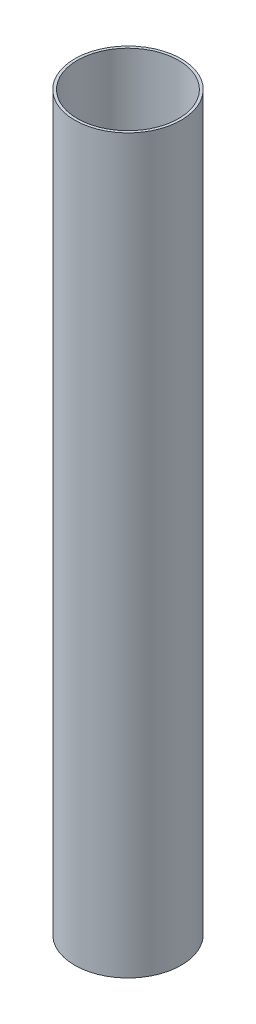
ISO-10303-21;
HEADER;
FILE_DESCRIPTION(('STEP AP214'),'2;1');
FILE_NAME('part.step','',(''),(''),'','','');
FILE_SCHEMA(('AUTOMOTIVE_DESIGN { 1 0 10303 214 1 1 1 1 }'));
ENDSEC;
DATA;
#1=APPLICATION_CONTEXT('core data for automotive mechanical design processes');
#2=APPLICATION_PROTOCOL_DEFINITION('international standard','automotive_design',2000,#1);
#3=PRODUCT_CONTEXT('',#1,'mechanical');
#4=PRODUCT('Part','Part','',(#3));
#5=PRODUCT_RELATED_PRODUCT_CATEGORY('part','',(#4));
#6=PRODUCT_DEFINITION_FORMATION('','',#4);
#7=PRODUCT_DEFINITION_CONTEXT('part definition',#1,'design');
#8=PRODUCT_DEFINITION('design','',#6,#7);
#9=PRODUCT_DEFINITION_SHAPE('','',#8);
#10=(LENGTH_UNIT() NAMED_UNIT(*) SI_UNIT(.MILLI.,.METRE.));
#11=(NAMED_UNIT(*) PLANE_ANGLE_UNIT() SI_UNIT($,.RADIAN.));
#12=(NAMED_UNIT(*) SI_UNIT($,.STERADIAN.) SOLID_ANGLE_UNIT());
#13=UNCERTAINTY_MEASURE_WITH_UNIT(LENGTH_MEASURE(1.E-05),#10,'distance_accuracy_value','');
#14=(GEOMETRIC_REPRESENTATION_CONTEXT(3) GLOBAL_UNCERTAINTY_ASSIGNED_CONTEXT((#13)) GLOBAL_UNIT_ASSIGNED_CONTEXT((#10,
#11,#12)) REPRESENTATION_CONTEXT('',''));
#15=CARTESIAN_POINT('',(0.,0.,0.));
#16=DIRECTION('',(0.,0.,1.));
#17=DIRECTION('',(1.,0.,0.));
#18=AXIS2_PLACEMENT_3D('',#15,#16,#17);
#19=CARTESIAN_POINT('',(0.,550.,0.));
#20=DIRECTION('',(0.,1.,0.));
#21=DIRECTION('',(0.,0.,1.));
#22=AXIS2_PLACEMENT_3D('',#19,#20,#21);
#23=PLANE('',#22);
#24=CARTESIAN_POINT('',(0.,550.,0.));
#25=DIRECTION('',(0.,1.,0.));
#26=DIRECTION('',(0.,0.,1.));
#27=AXIS2_PLACEMENT_3D('',#24,#25,#26);
#28=CIRCLE('',#27,40.);
#29=CARTESIAN_POINT('',(0.,550.,40.));
#30=VERTEX_POINT('',#29);
#31=EDGE_CURVE('E10',#30,#30,#28,.T.);
#32=ORIENTED_EDGE('',*,*,#31,.T.);
#33=EDGE_LOOP('',(#32));
#34=FACE_BOUND('',#33,.T.);
#35=CARTESIAN_POINT('',(0.,550.,0.));
#36=DIRECTION('',(0.,1.,0.));
#37=DIRECTION('',(0.,0.,1.));
#38=AXIS2_PLACEMENT_3D('',#35,#36,#37);
#39=CIRCLE('',#38,38.);
#40=CARTESIAN_POINT('',(0.,550.,38.));
#41=VERTEX_POINT('',#40);
#42=EDGE_CURVE('E46',#41,#41,#39,.T.);
#43=ORIENTED_EDGE('',*,*,#42,.F.);
#44=EDGE_LOOP('',(#43));
#45=FACE_BOUND('',#44,.T.);
#46=ADVANCED_FACE('F35',(#34,#45),#23,.T.);
#47=CARTESIAN_POINT('',(0.,0.,0.));
#48=DIRECTION('',(0.,1.,0.));
#49=DIRECTION('',(0.,0.,1.));
#50=AXIS2_PLACEMENT_3D('',#47,#48,#49);
#51=PLANE('',#50);
#52=CARTESIAN_POINT('',(0.,0.,0.));
#53=DIRECTION('',(0.,1.,0.));
#54=DIRECTION('',(0.,0.,1.));
#55=AXIS2_PLACEMENT_3D('',#52,#53,#54);
#56=CIRCLE('',#55,40.);
#57=CARTESIAN_POINT('',(0.,0.,40.));
#58=VERTEX_POINT('',#57);
#59=EDGE_CURVE('E39',#58,#58,#56,.T.);
#60=ORIENTED_EDGE('',*,*,#59,.F.);
#61=EDGE_LOOP('',(#60));
#62=FACE_BOUND('',#61,.T.);
#63=CARTESIAN_POINT('',(0.,0.,0.));
#64=DIRECTION('',(0.,1.,0.));
#65=DIRECTION('',(0.,0.,1.));
#66=AXIS2_PLACEMENT_3D('',#63,#64,#65);
#67=CIRCLE('',#66,38.);
#68=CARTESIAN_POINT('',(0.,0.,38.));
#69=VERTEX_POINT('',#68);
#70=EDGE_CURVE('E48',#69,#69,#67,.T.);
#71=ORIENTED_EDGE('',*,*,#70,.T.);
#72=EDGE_LOOP('',(#71));
#73=FACE_BOUND('',#72,.T.);
#74=ADVANCED_FACE('F58',(#62,#73),#51,.F.);
#75=CARTESIAN_POINT('',(0.,550.,0.));
#76=DIRECTION('',(0.,-1.,0.));
#77=DIRECTION('',(0.,0.,-1.));
#78=AXIS2_PLACEMENT_3D('',#75,#76,#77);
#79=CYLINDRICAL_SURFACE('',#78,40.);
#80=ORIENTED_EDGE('',*,*,#31,.F.);
#81=EDGE_LOOP('',(#80));
#82=FACE_BOUND('',#81,.T.);
#83=ORIENTED_EDGE('',*,*,#59,.T.);
#84=EDGE_LOOP('',(#83));
#85=FACE_BOUND('',#84,.T.);
#86=ADVANCED_FACE('F37',(#82,#85),#79,.T.);
#87=CARTESIAN_POINT('',(0.,550.,0.));
#88=DIRECTION('',(0.,-1.,0.));
#89=DIRECTION('',(0.,0.,-1.));
#90=AXIS2_PLACEMENT_3D('',#87,#88,#89);
#91=CYLINDRICAL_SURFACE('',#90,38.);
#92=ORIENTED_EDGE('',*,*,#42,.T.);
#93=EDGE_LOOP('',(#92));
#94=FACE_BOUND('',#93,.T.);
#95=ORIENTED_EDGE('',*,*,#70,.F.);
#96=EDGE_LOOP('',(#95));
#97=FACE_BOUND('',#96,.T.);
#98=ADVANCED_FACE('F54',(#94,#97),#91,.F.);
#99=CLOSED_SHELL('',(#46,#74,#86,#98));
#100=MANIFOLD_SOLID_BREP('B2',#99);
#101=ADVANCED_BREP_SHAPE_REPRESENTATION('',(#18,#100),#14);
#102=SHAPE_DEFINITION_REPRESENTATION(#9,#101);
ENDSEC;
END-ISO-10303-21;
